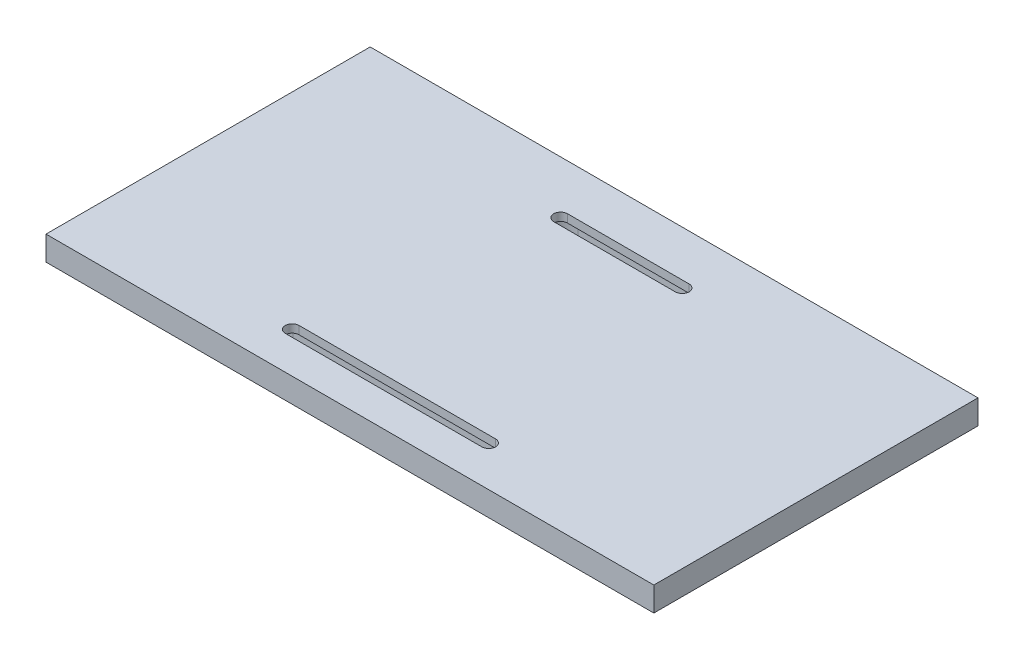
ISO-10303-21;
HEADER;
FILE_DESCRIPTION(('STEP AP214'),'2;1');
FILE_NAME('part.step','',(''),(''),'','','');
FILE_SCHEMA(('AUTOMOTIVE_DESIGN { 1 0 10303 214 1 1 1 1 }'));
ENDSEC;
DATA;
#1=APPLICATION_CONTEXT('core data for automotive mechanical design processes');
#2=APPLICATION_PROTOCOL_DEFINITION('international standard','automotive_design',2000,#1);
#3=PRODUCT_CONTEXT('',#1,'mechanical');
#4=PRODUCT('Part','Part','',(#3));
#5=PRODUCT_RELATED_PRODUCT_CATEGORY('part','',(#4));
#6=PRODUCT_DEFINITION_FORMATION('','',#4);
#7=PRODUCT_DEFINITION_CONTEXT('part definition',#1,'design');
#8=PRODUCT_DEFINITION('design','',#6,#7);
#9=PRODUCT_DEFINITION_SHAPE('','',#8);
#10=(LENGTH_UNIT() NAMED_UNIT(*) SI_UNIT(.MILLI.,.METRE.));
#11=(NAMED_UNIT(*) PLANE_ANGLE_UNIT() SI_UNIT($,.RADIAN.));
#12=(NAMED_UNIT(*) SI_UNIT($,.STERADIAN.) SOLID_ANGLE_UNIT());
#13=UNCERTAINTY_MEASURE_WITH_UNIT(LENGTH_MEASURE(1.E-05),#10,'distance_accuracy_value','');
#14=(GEOMETRIC_REPRESENTATION_CONTEXT(3) GLOBAL_UNCERTAINTY_ASSIGNED_CONTEXT((#13)) GLOBAL_UNIT_ASSIGNED_CONTEXT((#10,
#11,#12)) REPRESENTATION_CONTEXT('',''));
#15=CARTESIAN_POINT('',(0.,0.,0.));
#16=DIRECTION('',(0.,0.,1.));
#17=DIRECTION('',(1.,0.,0.));
#18=AXIS2_PLACEMENT_3D('',#15,#16,#17);
#19=CARTESIAN_POINT('',(99.25,0.,-10.));
#20=DIRECTION('',(0.,-1.,0.));
#21=DIRECTION('',(0.,0.,-1.));
#22=AXIS2_PLACEMENT_3D('',#19,#20,#21);
#23=CYLINDRICAL_SURFACE('',#22,1.69999999999999);
#24=DIRECTION('',(0.,-1.,0.));
#25=VECTOR('',#24,1.);
#26=CARTESIAN_POINT('',(99.25,8.,-11.7));
#27=LINE('',#26,#25);
#28=CARTESIAN_POINT('',(99.25,6.,-11.7));
#29=VERTEX_POINT('',#28);
#30=CARTESIAN_POINT('',(99.25,4.,-11.7));
#31=VERTEX_POINT('',#30);
#32=EDGE_CURVE('E645',#29,#31,#27,.T.);
#33=ORIENTED_EDGE('',*,*,#32,.T.);
#34=CARTESIAN_POINT('',(99.25,4.,-10.));
#35=DIRECTION('',(0.,-1.,0.));
#36=DIRECTION('',(0.,0.,-1.));
#37=AXIS2_PLACEMENT_3D('',#34,#35,#36);
#38=CIRCLE('',#37,1.69999999999999);
#39=CARTESIAN_POINT('',(99.25,4.,-8.3));
#40=VERTEX_POINT('',#39);
#41=EDGE_CURVE('E197',#40,#31,#38,.F.);
#42=ORIENTED_EDGE('',*,*,#41,.F.);
#43=DIRECTION('',(0.,-1.,0.));
#44=VECTOR('',#43,1.);
#45=CARTESIAN_POINT('',(99.25,8.,-8.3));
#46=LINE('',#45,#44);
#47=CARTESIAN_POINT('',(99.25,6.,-8.3));
#48=VERTEX_POINT('',#47);
#49=EDGE_CURVE('E56',#48,#40,#46,.T.);
#50=ORIENTED_EDGE('',*,*,#49,.F.);
#51=CARTESIAN_POINT('',(99.25,6.,-10.));
#52=DIRECTION('',(0.,-1.,0.));
#53=DIRECTION('',(0.,0.,-1.));
#54=AXIS2_PLACEMENT_3D('',#51,#52,#53);
#55=CIRCLE('',#54,1.69999999999999);
#56=EDGE_CURVE('E313',#29,#48,#55,.T.);
#57=ORIENTED_EDGE('',*,*,#56,.F.);
#58=EDGE_LOOP('',(#33,#42,#50,#57));
#59=FACE_BOUND('',#58,.T.);
#60=ADVANCED_FACE('F39',(#59),#23,.F.);
#61=CARTESIAN_POINT('',(50.75,0.,-10.));
#62=DIRECTION('',(0.,-1.,0.));
#63=DIRECTION('',(0.,0.,-1.));
#64=AXIS2_PLACEMENT_3D('',#61,#62,#63);
#65=CYLINDRICAL_SURFACE('',#64,1.7);
#66=CARTESIAN_POINT('',(50.75,4.,-10.));
#67=DIRECTION('',(0.,-1.,0.));
#68=DIRECTION('',(0.,0.,-1.));
#69=AXIS2_PLACEMENT_3D('',#66,#67,#68);
#70=CIRCLE('',#69,1.7);
#71=CARTESIAN_POINT('',(50.75,4.,-11.7));
#72=VERTEX_POINT('',#71);
#73=CARTESIAN_POINT('',(50.75,4.,-8.3));
#74=VERTEX_POINT('',#73);
#75=EDGE_CURVE('E43',#72,#74,#70,.F.);
#76=ORIENTED_EDGE('',*,*,#75,.F.);
#77=DIRECTION('',(0.,-1.,0.));
#78=VECTOR('',#77,1.);
#79=CARTESIAN_POINT('',(50.75,8.,-11.7));
#80=LINE('',#79,#78);
#81=CARTESIAN_POINT('',(50.75,6.,-11.7));
#82=VERTEX_POINT('',#81);
#83=EDGE_CURVE('E64',#82,#72,#80,.T.);
#84=ORIENTED_EDGE('',*,*,#83,.F.);
#85=CARTESIAN_POINT('',(50.75,6.,-10.));
#86=DIRECTION('',(0.,-1.,0.));
#87=DIRECTION('',(0.,0.,-1.));
#88=AXIS2_PLACEMENT_3D('',#85,#86,#87);
#89=CIRCLE('',#88,1.7);
#90=CARTESIAN_POINT('',(50.75,6.,-8.3));
#91=VERTEX_POINT('',#90);
#92=EDGE_CURVE('E191',#91,#82,#89,.T.);
#93=ORIENTED_EDGE('',*,*,#92,.F.);
#94=DIRECTION('',(0.,-1.,0.));
#95=VECTOR('',#94,1.);
#96=CARTESIAN_POINT('',(50.75,8.,-8.3));
#97=LINE('',#96,#95);
#98=EDGE_CURVE('E177',#91,#74,#97,.T.);
#99=ORIENTED_EDGE('',*,*,#98,.T.);
#100=EDGE_LOOP('',(#76,#84,#93,#99));
#101=FACE_BOUND('',#100,.T.);
#102=ADVANCED_FACE('F189',(#101),#65,.F.);
#103=CARTESIAN_POINT('',(90.,0.,-67.));
#104=DIRECTION('',(0.,-1.,0.));
#105=DIRECTION('',(0.,0.,-1.));
#106=AXIS2_PLACEMENT_3D('',#103,#104,#105);
#107=CYLINDRICAL_SURFACE('',#106,1.69999999999999);
#108=DIRECTION('',(0.,-1.,0.));
#109=VECTOR('',#108,1.);
#110=CARTESIAN_POINT('',(90.,6.,-68.7));
#111=LINE('',#110,#109);
#112=CARTESIAN_POINT('',(90.,6.,-68.7));
#113=VERTEX_POINT('',#112);
#114=CARTESIAN_POINT('',(90.,4.,-68.7));
#115=VERTEX_POINT('',#114);
#116=EDGE_CURVE('E230',#113,#115,#111,.T.);
#117=ORIENTED_EDGE('',*,*,#116,.T.);
#118=CARTESIAN_POINT('',(90.,4.,-67.));
#119=DIRECTION('',(0.,-1.,0.));
#120=DIRECTION('',(0.,0.,-1.));
#121=AXIS2_PLACEMENT_3D('',#118,#119,#120);
#122=CIRCLE('',#121,1.69999999999999);
#123=CARTESIAN_POINT('',(90.,4.,-65.3));
#124=VERTEX_POINT('',#123);
#125=EDGE_CURVE('E278',#124,#115,#122,.F.);
#126=ORIENTED_EDGE('',*,*,#125,.F.);
#127=DIRECTION('',(0.,-1.,0.));
#128=VECTOR('',#127,1.);
#129=CARTESIAN_POINT('',(90.,6.,-65.3));
#130=LINE('',#129,#128);
#131=CARTESIAN_POINT('',(90.,6.,-65.3));
#132=VERTEX_POINT('',#131);
#133=EDGE_CURVE('E229',#132,#124,#130,.T.);
#134=ORIENTED_EDGE('',*,*,#133,.F.);
#135=CARTESIAN_POINT('',(90.,6.,-67.));
#136=DIRECTION('',(0.,-1.,0.));
#137=DIRECTION('',(0.,0.,-1.));
#138=AXIS2_PLACEMENT_3D('',#135,#136,#137);
#139=CIRCLE('',#138,1.69999999999999);
#140=EDGE_CURVE('E292',#113,#132,#139,.T.);
#141=ORIENTED_EDGE('',*,*,#140,.F.);
#142=EDGE_LOOP('',(#117,#126,#134,#141));
#143=FACE_BOUND('',#142,.T.);
#144=ADVANCED_FACE('F370',(#143),#107,.F.);
#145=CARTESIAN_POINT('',(60.,0.,-67.));
#146=DIRECTION('',(0.,-1.,0.));
#147=DIRECTION('',(0.,0.,-1.));
#148=AXIS2_PLACEMENT_3D('',#145,#146,#147);
#149=CYLINDRICAL_SURFACE('',#148,1.7);
#150=CARTESIAN_POINT('',(60.,4.,-67.));
#151=DIRECTION('',(0.,-1.,0.));
#152=DIRECTION('',(0.,0.,-1.));
#153=AXIS2_PLACEMENT_3D('',#150,#151,#152);
#154=CIRCLE('',#153,1.7);
#155=CARTESIAN_POINT('',(60.,4.,-68.7));
#156=VERTEX_POINT('',#155);
#157=CARTESIAN_POINT('',(60.,4.,-65.3));
#158=VERTEX_POINT('',#157);
#159=EDGE_CURVE('E288',#156,#158,#154,.F.);
#160=ORIENTED_EDGE('',*,*,#159,.F.);
#161=DIRECTION('',(0.,-1.,0.));
#162=VECTOR('',#161,1.);
#163=CARTESIAN_POINT('',(60.,6.,-68.7));
#164=LINE('',#163,#162);
#165=CARTESIAN_POINT('',(60.,6.,-68.7));
#166=VERTEX_POINT('',#165);
#167=EDGE_CURVE('E235',#166,#156,#164,.T.);
#168=ORIENTED_EDGE('',*,*,#167,.F.);
#169=CARTESIAN_POINT('',(60.,6.,-67.));
#170=DIRECTION('',(0.,-1.,0.));
#171=DIRECTION('',(0.,0.,-1.));
#172=AXIS2_PLACEMENT_3D('',#169,#170,#171);
#173=CIRCLE('',#172,1.7);
#174=CARTESIAN_POINT('',(60.,6.,-65.3));
#175=VERTEX_POINT('',#174);
#176=EDGE_CURVE('E341',#175,#166,#173,.T.);
#177=ORIENTED_EDGE('',*,*,#176,.F.);
#178=DIRECTION('',(0.,-1.,0.));
#179=VECTOR('',#178,1.);
#180=CARTESIAN_POINT('',(60.,6.,-65.3));
#181=LINE('',#180,#179);
#182=EDGE_CURVE('E238',#175,#158,#181,.T.);
#183=ORIENTED_EDGE('',*,*,#182,.T.);
#184=EDGE_LOOP('',(#160,#168,#177,#183));
#185=FACE_BOUND('',#184,.T.);
#186=ADVANCED_FACE('F361',(#185),#149,.F.);
#187=CARTESIAN_POINT('',(0.,6.,0.));
#188=DIRECTION('',(1.,0.,0.));
#189=DIRECTION('',(0.,0.,-1.));
#190=AXIS2_PLACEMENT_3D('',#187,#188,#189);
#191=PLANE('',#190);
#192=DIRECTION('',(0.,0.,1.));
#193=VECTOR('',#192,1.);
#194=CARTESIAN_POINT('',(0.,0.,0.));
#195=LINE('',#194,#193);
#196=CARTESIAN_POINT('',(0.,0.,-80.));
#197=VERTEX_POINT('',#196);
#198=CARTESIAN_POINT('',(0.,0.,0.));
#199=VERTEX_POINT('',#198);
#200=EDGE_CURVE('E308',#197,#199,#195,.T.);
#201=ORIENTED_EDGE('',*,*,#200,.T.);
#202=DIRECTION('',(0.,-1.,0.));
#203=VECTOR('',#202,1.);
#204=CARTESIAN_POINT('',(0.,6.,0.));
#205=LINE('',#204,#203);
#206=CARTESIAN_POINT('',(0.,6.,0.));
#207=VERTEX_POINT('',#206);
#208=EDGE_CURVE('E332',#207,#199,#205,.T.);
#209=ORIENTED_EDGE('',*,*,#208,.F.);
#210=DIRECTION('',(0.,0.,1.));
#211=VECTOR('',#210,1.);
#212=CARTESIAN_POINT('',(0.,6.,0.));
#213=LINE('',#212,#211);
#214=CARTESIAN_POINT('',(0.,6.,-80.));
#215=VERTEX_POINT('',#214);
#216=EDGE_CURVE('E293',#215,#207,#213,.T.);
#217=ORIENTED_EDGE('',*,*,#216,.F.);
#218=DIRECTION('',(0.,-1.,0.));
#219=VECTOR('',#218,1.);
#220=CARTESIAN_POINT('',(0.,6.,-80.));
#221=LINE('',#220,#219);
#222=EDGE_CURVE('E307',#215,#197,#221,.T.);
#223=ORIENTED_EDGE('',*,*,#222,.T.);
#224=EDGE_LOOP('',(#201,#209,#217,#223));
#225=FACE_BOUND('',#224,.T.);
#226=ADVANCED_FACE('F41',(#225),#191,.F.);
#227=CARTESIAN_POINT('',(0.,6.,0.));
#228=DIRECTION('',(0.,0.,-1.));
#229=DIRECTION('',(-1.,0.,0.));
#230=AXIS2_PLACEMENT_3D('',#227,#228,#229);
#231=PLANE('',#230);
#232=DIRECTION('',(1.,0.,0.));
#233=VECTOR('',#232,1.);
#234=CARTESIAN_POINT('',(0.,0.,0.));
#235=LINE('',#234,#233);
#236=CARTESIAN_POINT('',(150.,0.,0.));
#237=VERTEX_POINT('',#236);
#238=EDGE_CURVE('E312',#199,#237,#235,.T.);
#239=ORIENTED_EDGE('',*,*,#238,.T.);
#240=DIRECTION('',(0.,-1.,0.));
#241=VECTOR('',#240,1.);
#242=CARTESIAN_POINT('',(150.,6.,0.));
#243=LINE('',#242,#241);
#244=CARTESIAN_POINT('',(150.,6.,0.));
#245=VERTEX_POINT('',#244);
#246=EDGE_CURVE('E328',#245,#237,#243,.T.);
#247=ORIENTED_EDGE('',*,*,#246,.F.);
#248=DIRECTION('',(1.,0.,0.));
#249=VECTOR('',#248,1.);
#250=CARTESIAN_POINT('',(0.,6.,0.));
#251=LINE('',#250,#249);
#252=EDGE_CURVE('E297',#207,#245,#251,.T.);
#253=ORIENTED_EDGE('',*,*,#252,.F.);
#254=ORIENTED_EDGE('',*,*,#208,.T.);
#255=EDGE_LOOP('',(#239,#247,#253,#254));
#256=FACE_BOUND('',#255,.T.);
#257=ADVANCED_FACE('F388',(#256),#231,.F.);
#258=CARTESIAN_POINT('',(150.,6.,0.));
#259=DIRECTION('',(-1.,0.,0.));
#260=DIRECTION('',(0.,0.,1.));
#261=AXIS2_PLACEMENT_3D('',#258,#259,#260);
#262=PLANE('',#261);
#263=DIRECTION('',(0.,0.,-1.));
#264=VECTOR('',#263,1.);
#265=CARTESIAN_POINT('',(150.,0.,0.));
#266=LINE('',#265,#264);
#267=CARTESIAN_POINT('',(150.,0.,-80.));
#268=VERTEX_POINT('',#267);
#269=EDGE_CURVE('E316',#237,#268,#266,.T.);
#270=ORIENTED_EDGE('',*,*,#269,.T.);
#271=DIRECTION('',(0.,-1.,0.));
#272=VECTOR('',#271,1.);
#273=CARTESIAN_POINT('',(150.,6.,-80.));
#274=LINE('',#273,#272);
#275=CARTESIAN_POINT('',(150.,6.,-80.));
#276=VERTEX_POINT('',#275);
#277=EDGE_CURVE('E324',#276,#268,#274,.T.);
#278=ORIENTED_EDGE('',*,*,#277,.F.);
#279=DIRECTION('',(0.,0.,-1.));
#280=VECTOR('',#279,1.);
#281=CARTESIAN_POINT('',(150.,6.,0.));
#282=LINE('',#281,#280);
#283=EDGE_CURVE('E301',#245,#276,#282,.T.);
#284=ORIENTED_EDGE('',*,*,#283,.F.);
#285=ORIENTED_EDGE('',*,*,#246,.T.);
#286=EDGE_LOOP('',(#270,#278,#284,#285));
#287=FACE_BOUND('',#286,.T.);
#288=ADVANCED_FACE('F393',(#287),#262,.F.);
#289=CARTESIAN_POINT('',(0.,6.,-80.));
#290=DIRECTION('',(0.,0.,1.));
#291=DIRECTION('',(1.,0.,0.));
#292=AXIS2_PLACEMENT_3D('',#289,#290,#291);
#293=PLANE('',#292);
#294=DIRECTION('',(-1.,0.,0.));
#295=VECTOR('',#294,1.);
#296=CARTESIAN_POINT('',(0.,0.,-80.));
#297=LINE('',#296,#295);
#298=EDGE_CURVE('E298',#268,#197,#297,.T.);
#299=ORIENTED_EDGE('',*,*,#298,.T.);
#300=ORIENTED_EDGE('',*,*,#222,.F.);
#301=DIRECTION('',(-1.,0.,0.));
#302=VECTOR('',#301,1.);
#303=CARTESIAN_POINT('',(0.,6.,-80.));
#304=LINE('',#303,#302);
#305=EDGE_CURVE('E304',#276,#215,#304,.T.);
#306=ORIENTED_EDGE('',*,*,#305,.F.);
#307=ORIENTED_EDGE('',*,*,#277,.T.);
#308=EDGE_LOOP('',(#299,#300,#306,#307));
#309=FACE_BOUND('',#308,.T.);
#310=ADVANCED_FACE('F376',(#309),#293,.F.);
#311=CARTESIAN_POINT('',(0.,6.,0.));
#312=DIRECTION('',(0.,-1.,0.));
#313=DIRECTION('',(0.,0.,-1.));
#314=AXIS2_PLACEMENT_3D('',#311,#312,#313);
#315=PLANE('',#314);
#316=ORIENTED_EDGE('',*,*,#176,.T.);
#317=DIRECTION('',(1.,0.,0.));
#318=VECTOR('',#317,1.);
#319=CARTESIAN_POINT('',(90.,6.,-68.7));
#320=LINE('',#319,#318);
#321=EDGE_CURVE('E225',#166,#113,#320,.T.);
#322=ORIENTED_EDGE('',*,*,#321,.T.);
#323=ORIENTED_EDGE('',*,*,#140,.T.);
#324=DIRECTION('',(-1.,0.,0.));
#325=VECTOR('',#324,1.);
#326=CARTESIAN_POINT('',(90.,6.,-65.3));
#327=LINE('',#326,#325);
#328=EDGE_CURVE('E201',#132,#175,#327,.T.);
#329=ORIENTED_EDGE('',*,*,#328,.T.);
#330=EDGE_LOOP('',(#316,#322,#323,#329));
#331=FACE_BOUND('',#330,.T.);
#332=ORIENTED_EDGE('',*,*,#92,.T.);
#333=DIRECTION('',(1.,0.,0.));
#334=VECTOR('',#333,1.);
#335=CARTESIAN_POINT('',(0.,6.,-11.7));
#336=LINE('',#335,#334);
#337=EDGE_CURVE('E618',#82,#29,#336,.T.);
#338=ORIENTED_EDGE('',*,*,#337,.T.);
#339=ORIENTED_EDGE('',*,*,#56,.T.);
#340=DIRECTION('',(-1.,0.,0.));
#341=VECTOR('',#340,1.);
#342=CARTESIAN_POINT('',(0.,6.,-8.3));
#343=LINE('',#342,#341);
#344=EDGE_CURVE('E623',#48,#91,#343,.T.);
#345=ORIENTED_EDGE('',*,*,#344,.T.);
#346=EDGE_LOOP('',(#332,#338,#339,#345));
#347=FACE_BOUND('',#346,.T.);
#348=ORIENTED_EDGE('',*,*,#216,.T.);
#349=ORIENTED_EDGE('',*,*,#252,.T.);
#350=ORIENTED_EDGE('',*,*,#283,.T.);
#351=ORIENTED_EDGE('',*,*,#305,.T.);
#352=EDGE_LOOP('',(#348,#349,#350,#351));
#353=FACE_BOUND('',#352,.T.);
#354=ADVANCED_FACE('F372',(#331,#347,#353),#315,.F.);
#355=CARTESIAN_POINT('',(0.,0.,0.));
#356=DIRECTION('',(0.,-1.,0.));
#357=DIRECTION('',(0.,0.,-1.));
#358=AXIS2_PLACEMENT_3D('',#355,#356,#357);
#359=PLANE('',#358);
#360=CARTESIAN_POINT('',(102.5,0.,-10.));
#361=DIRECTION('',(0.,-1.,0.));
#362=DIRECTION('',(0.,0.,-1.));
#363=AXIS2_PLACEMENT_3D('',#360,#361,#362);
#364=CIRCLE('',#363,3.5);
#365=CARTESIAN_POINT('',(102.5,0.,-13.5));
#366=VERTEX_POINT('',#365);
#367=CARTESIAN_POINT('',(102.5,0.,-6.5));
#368=VERTEX_POINT('',#367);
#369=EDGE_CURVE('E614',#366,#368,#364,.T.);
#370=ORIENTED_EDGE('',*,*,#369,.F.);
#371=DIRECTION('',(1.,0.,0.));
#372=VECTOR('',#371,1.);
#373=CARTESIAN_POINT('',(102.5,0.,-13.5));
#374=LINE('',#373,#372);
#375=CARTESIAN_POINT('',(47.5,0.,-13.5));
#376=VERTEX_POINT('',#375);
#377=EDGE_CURVE('E212',#376,#366,#374,.T.);
#378=ORIENTED_EDGE('',*,*,#377,.F.);
#379=CARTESIAN_POINT('',(47.5,0.,-10.));
#380=DIRECTION('',(0.,-1.,0.));
#381=DIRECTION('',(0.,0.,-1.));
#382=AXIS2_PLACEMENT_3D('',#379,#380,#381);
#383=CIRCLE('',#382,3.5);
#384=CARTESIAN_POINT('',(47.5,0.,-6.5));
#385=VERTEX_POINT('',#384);
#386=EDGE_CURVE('E612',#385,#376,#383,.T.);
#387=ORIENTED_EDGE('',*,*,#386,.F.);
#388=DIRECTION('',(-1.,0.,0.));
#389=VECTOR('',#388,1.);
#390=CARTESIAN_POINT('',(102.5,0.,-6.5));
#391=LINE('',#390,#389);
#392=EDGE_CURVE('E616',#368,#385,#391,.T.);
#393=ORIENTED_EDGE('',*,*,#392,.F.);
#394=EDGE_LOOP('',(#370,#378,#387,#393));
#395=FACE_BOUND('',#394,.T.);
#396=CARTESIAN_POINT('',(90.,0.,-67.));
#397=DIRECTION('',(0.,-1.,0.));
#398=DIRECTION('',(0.,0.,-1.));
#399=AXIS2_PLACEMENT_3D('',#396,#397,#398);
#400=CIRCLE('',#399,4.2786666312557);
#401=CARTESIAN_POINT('',(90.,0.,-71.2786666312557));
#402=VERTEX_POINT('',#401);
#403=CARTESIAN_POINT('',(90.,0.,-62.7213333687443));
#404=VERTEX_POINT('',#403);
#405=EDGE_CURVE('E234',#402,#404,#400,.T.);
#406=ORIENTED_EDGE('',*,*,#405,.F.);
#407=DIRECTION('',(1.,0.,0.));
#408=VECTOR('',#407,1.);
#409=CARTESIAN_POINT('',(90.,0.,-71.2786666312557));
#410=LINE('',#409,#408);
#411=CARTESIAN_POINT('',(60.,0.,-71.2786666312557));
#412=VERTEX_POINT('',#411);
#413=EDGE_CURVE('E249',#412,#402,#410,.T.);
#414=ORIENTED_EDGE('',*,*,#413,.F.);
#415=CARTESIAN_POINT('',(60.,0.,-67.));
#416=DIRECTION('',(0.,-1.,0.));
#417=DIRECTION('',(0.,0.,-1.));
#418=AXIS2_PLACEMENT_3D('',#415,#416,#417);
#419=CIRCLE('',#418,4.2786666312557);
#420=CARTESIAN_POINT('',(60.,0.,-62.7213333687443));
#421=VERTEX_POINT('',#420);
#422=EDGE_CURVE('E268',#421,#412,#419,.T.);
#423=ORIENTED_EDGE('',*,*,#422,.F.);
#424=DIRECTION('',(-1.,0.,0.));
#425=VECTOR('',#424,1.);
#426=CARTESIAN_POINT('',(90.,0.,-62.7213333687443));
#427=LINE('',#426,#425);
#428=EDGE_CURVE('E264',#404,#421,#427,.T.);
#429=ORIENTED_EDGE('',*,*,#428,.F.);
#430=EDGE_LOOP('',(#406,#414,#423,#429));
#431=FACE_BOUND('',#430,.T.);
#432=ORIENTED_EDGE('',*,*,#200,.F.);
#433=ORIENTED_EDGE('',*,*,#298,.F.);
#434=ORIENTED_EDGE('',*,*,#269,.F.);
#435=ORIENTED_EDGE('',*,*,#238,.F.);
#436=EDGE_LOOP('',(#432,#433,#434,#435));
#437=FACE_BOUND('',#436,.T.);
#438=ADVANCED_FACE('F375',(#395,#431,#437),#359,.T.);
#439=CARTESIAN_POINT('',(90.,4.,-67.));
#440=DIRECTION('',(0.,-1.,0.));
#441=DIRECTION('',(0.,0.,-1.));
#442=AXIS2_PLACEMENT_3D('',#439,#440,#441);
#443=PLANE('',#442);
#444=DIRECTION('',(1.,0.,0.));
#445=VECTOR('',#444,1.);
#446=CARTESIAN_POINT('',(90.,4.,-68.7));
#447=LINE('',#446,#445);
#448=EDGE_CURVE('E11',#156,#115,#447,.T.);
#449=ORIENTED_EDGE('',*,*,#448,.F.);
#450=ORIENTED_EDGE('',*,*,#159,.T.);
#451=DIRECTION('',(-1.,0.,0.));
#452=VECTOR('',#451,1.);
#453=CARTESIAN_POINT('',(90.,4.,-65.3));
#454=LINE('',#453,#452);
#455=EDGE_CURVE('E49',#124,#158,#454,.T.);
#456=ORIENTED_EDGE('',*,*,#455,.F.);
#457=ORIENTED_EDGE('',*,*,#125,.T.);
#458=EDGE_LOOP('',(#449,#450,#456,#457));
#459=FACE_BOUND('',#458,.T.);
#460=CARTESIAN_POINT('',(90.,4.,-67.));
#461=DIRECTION('',(0.,-1.,0.));
#462=DIRECTION('',(0.,0.,-1.));
#463=AXIS2_PLACEMENT_3D('',#460,#461,#462);
#464=CIRCLE('',#463,4.2786666312557);
#465=CARTESIAN_POINT('',(90.,4.,-71.2786666312557));
#466=VERTEX_POINT('',#465);
#467=CARTESIAN_POINT('',(90.,4.,-62.7213333687443));
#468=VERTEX_POINT('',#467);
#469=EDGE_CURVE('E244',#466,#468,#464,.T.);
#470=ORIENTED_EDGE('',*,*,#469,.T.);
#471=DIRECTION('',(-1.,0.,0.));
#472=VECTOR('',#471,1.);
#473=CARTESIAN_POINT('',(90.,4.,-62.7213333687443));
#474=LINE('',#473,#472);
#475=CARTESIAN_POINT('',(60.,4.,-62.7213333687443));
#476=VERTEX_POINT('',#475);
#477=EDGE_CURVE('E248',#468,#476,#474,.T.);
#478=ORIENTED_EDGE('',*,*,#477,.T.);
#479=CARTESIAN_POINT('',(60.,4.,-67.));
#480=DIRECTION('',(0.,-1.,0.));
#481=DIRECTION('',(0.,0.,-1.));
#482=AXIS2_PLACEMENT_3D('',#479,#480,#481);
#483=CIRCLE('',#482,4.2786666312557);
#484=CARTESIAN_POINT('',(60.,4.,-71.2786666312557));
#485=VERTEX_POINT('',#484);
#486=EDGE_CURVE('E253',#476,#485,#483,.T.);
#487=ORIENTED_EDGE('',*,*,#486,.T.);
#488=DIRECTION('',(1.,0.,0.));
#489=VECTOR('',#488,1.);
#490=CARTESIAN_POINT('',(90.,4.,-71.2786666312557));
#491=LINE('',#490,#489);
#492=EDGE_CURVE('E257',#485,#466,#491,.T.);
#493=ORIENTED_EDGE('',*,*,#492,.T.);
#494=EDGE_LOOP('',(#470,#478,#487,#493));
#495=FACE_BOUND('',#494,.T.);
#496=ADVANCED_FACE('F364',(#459,#495),#443,.T.);
#497=CARTESIAN_POINT('',(90.,4.,-67.));
#498=DIRECTION('',(0.,-1.,0.));
#499=DIRECTION('',(0.,0.,-1.));
#500=AXIS2_PLACEMENT_3D('',#497,#498,#499);
#501=CYLINDRICAL_SURFACE('',#500,4.2786666312557);
#502=ORIENTED_EDGE('',*,*,#405,.T.);
#503=DIRECTION('',(0.,-1.,0.));
#504=VECTOR('',#503,1.);
#505=CARTESIAN_POINT('',(90.,4.,-62.7213333687443));
#506=LINE('',#505,#504);
#507=EDGE_CURVE('E261',#468,#404,#506,.T.);
#508=ORIENTED_EDGE('',*,*,#507,.F.);
#509=ORIENTED_EDGE('',*,*,#469,.F.);
#510=DIRECTION('',(0.,-1.,0.));
#511=VECTOR('',#510,1.);
#512=CARTESIAN_POINT('',(90.,4.,-71.2786666312557));
#513=LINE('',#512,#511);
#514=EDGE_CURVE('E275',#466,#402,#513,.T.);
#515=ORIENTED_EDGE('',*,*,#514,.T.);
#516=EDGE_LOOP('',(#502,#508,#509,#515));
#517=FACE_BOUND('',#516,.T.);
#518=ADVANCED_FACE('F403',(#517),#501,.F.);
#519=CARTESIAN_POINT('',(90.,4.,-71.2786666312557));
#520=DIRECTION('',(0.,0.,-1.));
#521=DIRECTION('',(-1.,0.,0.));
#522=AXIS2_PLACEMENT_3D('',#519,#520,#521);
#523=PLANE('',#522);
#524=ORIENTED_EDGE('',*,*,#413,.T.);
#525=ORIENTED_EDGE('',*,*,#514,.F.);
#526=ORIENTED_EDGE('',*,*,#492,.F.);
#527=DIRECTION('',(0.,-1.,0.));
#528=VECTOR('',#527,1.);
#529=CARTESIAN_POINT('',(60.,4.,-71.2786666312557));
#530=LINE('',#529,#528);
#531=EDGE_CURVE('E279',#485,#412,#530,.T.);
#532=ORIENTED_EDGE('',*,*,#531,.T.);
#533=EDGE_LOOP('',(#524,#525,#526,#532));
#534=FACE_BOUND('',#533,.T.);
#535=ADVANCED_FACE('F423',(#534),#523,.F.);
#536=CARTESIAN_POINT('',(60.,4.,-67.));
#537=DIRECTION('',(0.,-1.,0.));
#538=DIRECTION('',(0.,0.,-1.));
#539=AXIS2_PLACEMENT_3D('',#536,#537,#538);
#540=CYLINDRICAL_SURFACE('',#539,4.2786666312557);
#541=ORIENTED_EDGE('',*,*,#422,.T.);
#542=ORIENTED_EDGE('',*,*,#531,.F.);
#543=ORIENTED_EDGE('',*,*,#486,.F.);
#544=DIRECTION('',(0.,-1.,0.));
#545=VECTOR('',#544,1.);
#546=CARTESIAN_POINT('',(60.,4.,-62.7213333687443));
#547=LINE('',#546,#545);
#548=EDGE_CURVE('E282',#476,#421,#547,.T.);
#549=ORIENTED_EDGE('',*,*,#548,.T.);
#550=EDGE_LOOP('',(#541,#542,#543,#549));
#551=FACE_BOUND('',#550,.T.);
#552=ADVANCED_FACE('F428',(#551),#540,.F.);
#553=CARTESIAN_POINT('',(90.,4.,-62.7213333687443));
#554=DIRECTION('',(0.,0.,1.));
#555=DIRECTION('',(1.,0.,0.));
#556=AXIS2_PLACEMENT_3D('',#553,#554,#555);
#557=PLANE('',#556);
#558=ORIENTED_EDGE('',*,*,#428,.T.);
#559=ORIENTED_EDGE('',*,*,#548,.F.);
#560=ORIENTED_EDGE('',*,*,#477,.F.);
#561=ORIENTED_EDGE('',*,*,#507,.T.);
#562=EDGE_LOOP('',(#558,#559,#560,#561));
#563=FACE_BOUND('',#562,.T.);
#564=ADVANCED_FACE('F425',(#563),#557,.F.);
#565=CARTESIAN_POINT('',(90.,6.,-65.3));
#566=DIRECTION('',(0.,0.,1.));
#567=DIRECTION('',(1.,0.,0.));
#568=AXIS2_PLACEMENT_3D('',#565,#566,#567);
#569=PLANE('',#568);
#570=ORIENTED_EDGE('',*,*,#455,.T.);
#571=ORIENTED_EDGE('',*,*,#182,.F.);
#572=ORIENTED_EDGE('',*,*,#328,.F.);
#573=ORIENTED_EDGE('',*,*,#133,.T.);
#574=EDGE_LOOP('',(#570,#571,#572,#573));
#575=FACE_BOUND('',#574,.T.);
#576=ADVANCED_FACE('F354',(#575),#569,.F.);
#577=CARTESIAN_POINT('',(90.,6.,-68.7));
#578=DIRECTION('',(0.,0.,-1.));
#579=DIRECTION('',(-1.,0.,0.));
#580=AXIS2_PLACEMENT_3D('',#577,#578,#579);
#581=PLANE('',#580);
#582=ORIENTED_EDGE('',*,*,#448,.T.);
#583=ORIENTED_EDGE('',*,*,#116,.F.);
#584=ORIENTED_EDGE('',*,*,#321,.F.);
#585=ORIENTED_EDGE('',*,*,#167,.T.);
#586=EDGE_LOOP('',(#582,#583,#584,#585));
#587=FACE_BOUND('',#586,.T.);
#588=ADVANCED_FACE('F367',(#587),#581,.F.);
#589=CARTESIAN_POINT('',(102.5,4.,-10.));
#590=DIRECTION('',(0.,-1.,0.));
#591=DIRECTION('',(0.,0.,-1.));
#592=AXIS2_PLACEMENT_3D('',#589,#590,#591);
#593=PLANE('',#592);
#594=DIRECTION('',(1.,0.,0.));
#595=VECTOR('',#594,1.);
#596=CARTESIAN_POINT('',(99.25,4.,-11.7));
#597=LINE('',#596,#595);
#598=EDGE_CURVE('E184',#72,#31,#597,.T.);
#599=ORIENTED_EDGE('',*,*,#598,.F.);
#600=ORIENTED_EDGE('',*,*,#75,.T.);
#601=DIRECTION('',(-1.,0.,0.));
#602=VECTOR('',#601,1.);
#603=CARTESIAN_POINT('',(99.25,4.,-8.3));
#604=LINE('',#603,#602);
#605=EDGE_CURVE('E174',#40,#74,#604,.T.);
#606=ORIENTED_EDGE('',*,*,#605,.F.);
#607=ORIENTED_EDGE('',*,*,#41,.T.);
#608=EDGE_LOOP('',(#599,#600,#606,#607));
#609=FACE_BOUND('',#608,.T.);
#610=CARTESIAN_POINT('',(102.5,4.,-10.));
#611=DIRECTION('',(0.,-1.,0.));
#612=DIRECTION('',(0.,0.,-1.));
#613=AXIS2_PLACEMENT_3D('',#610,#611,#612);
#614=CIRCLE('',#613,3.5);
#615=CARTESIAN_POINT('',(102.5,4.,-13.5));
#616=VERTEX_POINT('',#615);
#617=CARTESIAN_POINT('',(102.5,4.,-6.5));
#618=VERTEX_POINT('',#617);
#619=EDGE_CURVE('E611',#616,#618,#614,.T.);
#620=ORIENTED_EDGE('',*,*,#619,.T.);
#621=DIRECTION('',(-1.,0.,0.));
#622=VECTOR('',#621,1.);
#623=CARTESIAN_POINT('',(102.5,4.,-6.5));
#624=LINE('',#623,#622);
#625=CARTESIAN_POINT('',(47.5,4.,-6.5));
#626=VERTEX_POINT('',#625);
#627=EDGE_CURVE('E633',#618,#626,#624,.T.);
#628=ORIENTED_EDGE('',*,*,#627,.T.);
#629=CARTESIAN_POINT('',(47.5,4.,-10.));
#630=DIRECTION('',(0.,-1.,0.));
#631=DIRECTION('',(0.,0.,-1.));
#632=AXIS2_PLACEMENT_3D('',#629,#630,#631);
#633=CIRCLE('',#632,3.5);
#634=CARTESIAN_POINT('',(47.5,4.,-13.5));
#635=VERTEX_POINT('',#634);
#636=EDGE_CURVE('E630',#626,#635,#633,.T.);
#637=ORIENTED_EDGE('',*,*,#636,.T.);
#638=DIRECTION('',(1.,0.,0.));
#639=VECTOR('',#638,1.);
#640=CARTESIAN_POINT('',(102.5,4.,-13.5));
#641=LINE('',#640,#639);
#642=EDGE_CURVE('E220',#635,#616,#641,.T.);
#643=ORIENTED_EDGE('',*,*,#642,.T.);
#644=EDGE_LOOP('',(#620,#628,#637,#643));
#645=FACE_BOUND('',#644,.T.);
#646=ADVANCED_FACE('F194',(#609,#645),#593,.T.);
#647=CARTESIAN_POINT('',(102.5,4.,-10.));
#648=DIRECTION('',(0.,-1.,0.));
#649=DIRECTION('',(0.,0.,-1.));
#650=AXIS2_PLACEMENT_3D('',#647,#648,#649);
#651=CYLINDRICAL_SURFACE('',#650,3.5);
#652=ORIENTED_EDGE('',*,*,#369,.T.);
#653=DIRECTION('',(0.,-1.,0.));
#654=VECTOR('',#653,1.);
#655=CARTESIAN_POINT('',(102.5,4.,-6.5));
#656=LINE('',#655,#654);
#657=EDGE_CURVE('E217',#618,#368,#656,.T.);
#658=ORIENTED_EDGE('',*,*,#657,.F.);
#659=ORIENTED_EDGE('',*,*,#619,.F.);
#660=DIRECTION('',(0.,-1.,0.));
#661=VECTOR('',#660,1.);
#662=CARTESIAN_POINT('',(102.5,4.,-13.5));
#663=LINE('',#662,#661);
#664=EDGE_CURVE('E198',#616,#366,#663,.T.);
#665=ORIENTED_EDGE('',*,*,#664,.T.);
#666=EDGE_LOOP('',(#652,#658,#659,#665));
#667=FACE_BOUND('',#666,.T.);
#668=ADVANCED_FACE('F440',(#667),#651,.F.);
#669=CARTESIAN_POINT('',(102.5,4.,-13.5));
#670=DIRECTION('',(0.,0.,-1.));
#671=DIRECTION('',(-1.,0.,0.));
#672=AXIS2_PLACEMENT_3D('',#669,#670,#671);
#673=PLANE('',#672);
#674=ORIENTED_EDGE('',*,*,#377,.T.);
#675=ORIENTED_EDGE('',*,*,#664,.F.);
#676=ORIENTED_EDGE('',*,*,#642,.F.);
#677=DIRECTION('',(0.,-1.,0.));
#678=VECTOR('',#677,1.);
#679=CARTESIAN_POINT('',(47.5,4.,-13.5));
#680=LINE('',#679,#678);
#681=EDGE_CURVE('E203',#635,#376,#680,.T.);
#682=ORIENTED_EDGE('',*,*,#681,.T.);
#683=EDGE_LOOP('',(#674,#675,#676,#682));
#684=FACE_BOUND('',#683,.T.);
#685=ADVANCED_FACE('F443',(#684),#673,.F.);
#686=CARTESIAN_POINT('',(47.5,4.,-10.));
#687=DIRECTION('',(0.,-1.,0.));
#688=DIRECTION('',(0.,0.,-1.));
#689=AXIS2_PLACEMENT_3D('',#686,#687,#688);
#690=CYLINDRICAL_SURFACE('',#689,3.5);
#691=ORIENTED_EDGE('',*,*,#386,.T.);
#692=ORIENTED_EDGE('',*,*,#681,.F.);
#693=ORIENTED_EDGE('',*,*,#636,.F.);
#694=DIRECTION('',(0.,-1.,0.));
#695=VECTOR('',#694,1.);
#696=CARTESIAN_POINT('',(47.5,4.,-6.5));
#697=LINE('',#696,#695);
#698=EDGE_CURVE('E209',#626,#385,#697,.T.);
#699=ORIENTED_EDGE('',*,*,#698,.T.);
#700=EDGE_LOOP('',(#691,#692,#693,#699));
#701=FACE_BOUND('',#700,.T.);
#702=ADVANCED_FACE('F447',(#701),#690,.F.);
#703=CARTESIAN_POINT('',(102.5,4.,-6.5));
#704=DIRECTION('',(0.,0.,1.));
#705=DIRECTION('',(1.,0.,0.));
#706=AXIS2_PLACEMENT_3D('',#703,#704,#705);
#707=PLANE('',#706);
#708=ORIENTED_EDGE('',*,*,#392,.T.);
#709=ORIENTED_EDGE('',*,*,#698,.F.);
#710=ORIENTED_EDGE('',*,*,#627,.F.);
#711=ORIENTED_EDGE('',*,*,#657,.T.);
#712=EDGE_LOOP('',(#708,#709,#710,#711));
#713=FACE_BOUND('',#712,.T.);
#714=ADVANCED_FACE('F444',(#713),#707,.F.);
#715=CARTESIAN_POINT('',(99.25,8.,-8.3));
#716=DIRECTION('',(0.,0.,1.));
#717=DIRECTION('',(1.,0.,0.));
#718=AXIS2_PLACEMENT_3D('',#715,#716,#717);
#719=PLANE('',#718);
#720=ORIENTED_EDGE('',*,*,#49,.T.);
#721=ORIENTED_EDGE('',*,*,#605,.T.);
#722=ORIENTED_EDGE('',*,*,#98,.F.);
#723=ORIENTED_EDGE('',*,*,#344,.F.);
#724=EDGE_LOOP('',(#720,#721,#722,#723));
#725=FACE_BOUND('',#724,.T.);
#726=ADVANCED_FACE('F176',(#725),#719,.F.);
#727=CARTESIAN_POINT('',(99.25,8.,-11.7));
#728=DIRECTION('',(0.,0.,-1.));
#729=DIRECTION('',(-1.,0.,0.));
#730=AXIS2_PLACEMENT_3D('',#727,#728,#729);
#731=PLANE('',#730);
#732=ORIENTED_EDGE('',*,*,#83,.T.);
#733=ORIENTED_EDGE('',*,*,#598,.T.);
#734=ORIENTED_EDGE('',*,*,#32,.F.);
#735=ORIENTED_EDGE('',*,*,#337,.F.);
#736=EDGE_LOOP('',(#732,#733,#734,#735));
#737=FACE_BOUND('',#736,.T.);
#738=ADVANCED_FACE('F459',(#737),#731,.F.);
#739=CLOSED_SHELL('',(#60,#102,#144,#186,#226,#257,#288,#310,#354,#438,#496,#518,#535,#552,#564,
#576,#588,#646,#668,#685,#702,#714,#726,#738));
#740=MANIFOLD_SOLID_BREP('B2',#739);
#741=ADVANCED_BREP_SHAPE_REPRESENTATION('',(#18,#740),#14);
#742=SHAPE_DEFINITION_REPRESENTATION(#9,#741);
ENDSEC;
END-ISO-10303-21;
